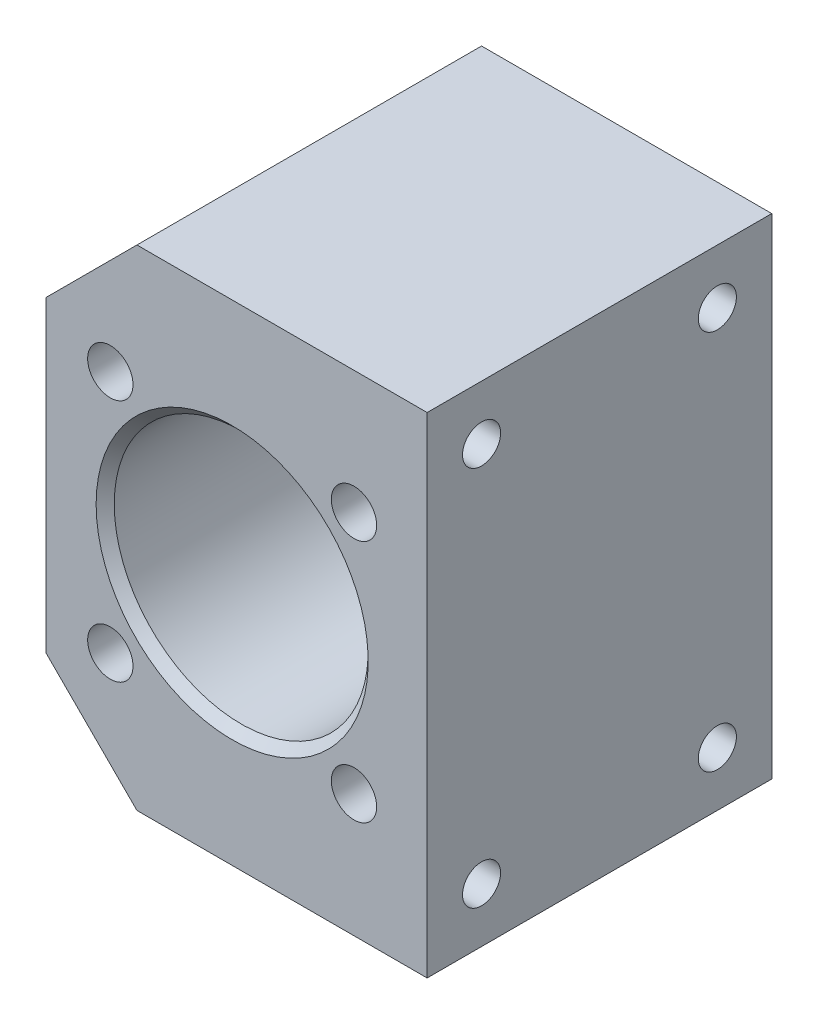
ISO-10303-21;
HEADER;
FILE_DESCRIPTION(('STEP AP214'),'2;1');
FILE_NAME('part.step','',(''),(''),'','','');
FILE_SCHEMA(('AUTOMOTIVE_DESIGN { 1 0 10303 214 1 1 1 1 }'));
ENDSEC;
DATA;
#1=APPLICATION_CONTEXT('core data for automotive mechanical design processes');
#2=APPLICATION_PROTOCOL_DEFINITION('international standard','automotive_design',2000,#1);
#3=PRODUCT_CONTEXT('',#1,'mechanical');
#4=PRODUCT('Part','Part','',(#3));
#5=PRODUCT_RELATED_PRODUCT_CATEGORY('part','',(#4));
#6=PRODUCT_DEFINITION_FORMATION('','',#4);
#7=PRODUCT_DEFINITION_CONTEXT('part definition',#1,'design');
#8=PRODUCT_DEFINITION('design','',#6,#7);
#9=PRODUCT_DEFINITION_SHAPE('','',#8);
#10=(LENGTH_UNIT() NAMED_UNIT(*) SI_UNIT(.MILLI.,.METRE.));
#11=(NAMED_UNIT(*) PLANE_ANGLE_UNIT() SI_UNIT($,.RADIAN.));
#12=(NAMED_UNIT(*) SI_UNIT($,.STERADIAN.) SOLID_ANGLE_UNIT());
#13=UNCERTAINTY_MEASURE_WITH_UNIT(LENGTH_MEASURE(1.E-05),#10,'distance_accuracy_value','');
#14=(GEOMETRIC_REPRESENTATION_CONTEXT(3) GLOBAL_UNCERTAINTY_ASSIGNED_CONTEXT((#13)) GLOBAL_UNIT_ASSIGNED_CONTEXT((#10,
#11,#12)) REPRESENTATION_CONTEXT('',''));
#15=CARTESIAN_POINT('',(0.,0.,0.));
#16=DIRECTION('',(0.,0.,1.));
#17=DIRECTION('',(1.,0.,0.));
#18=AXIS2_PLACEMENT_3D('',#15,#16,#17);
#19=CARTESIAN_POINT('',(0.,0.,38.));
#20=DIRECTION('',(0.,0.,-1.));
#21=DIRECTION('',(-1.,0.,0.));
#22=AXIS2_PLACEMENT_3D('',#19,#20,#21);
#23=PLANE('',#22);
#24=CARTESIAN_POINT('',(33.9350288425444,40.4350288425444,38.));
#25=DIRECTION('',(0.,0.,1.));
#26=DIRECTION('',(1.,0.,0.));
#27=AXIS2_PLACEMENT_3D('',#24,#25,#26);
#28=CIRCLE('',#27,2.5);
#29=CARTESIAN_POINT('',(36.4350288425444,40.4350288425444,38.));
#30=VERTEX_POINT('',#29);
#31=EDGE_CURVE('E142',#30,#30,#28,.T.);
#32=ORIENTED_EDGE('',*,*,#31,.F.);
#33=EDGE_LOOP('',(#32));
#34=FACE_BOUND('',#33,.T.);
#35=CARTESIAN_POINT('',(7.06497115745558,40.4350288425444,38.));
#36=DIRECTION('',(0.,0.,1.));
#37=DIRECTION('',(1.,0.,0.));
#38=AXIS2_PLACEMENT_3D('',#35,#36,#37);
#39=CIRCLE('',#38,2.5);
#40=CARTESIAN_POINT('',(9.56497115745558,40.4350288425444,38.));
#41=VERTEX_POINT('',#40);
#42=EDGE_CURVE('E148',#41,#41,#39,.T.);
#43=ORIENTED_EDGE('',*,*,#42,.F.);
#44=EDGE_LOOP('',(#43));
#45=FACE_BOUND('',#44,.T.);
#46=CARTESIAN_POINT('',(7.06497115745558,13.5649711574556,38.));
#47=DIRECTION('',(0.,0.,1.));
#48=DIRECTION('',(1.,0.,0.));
#49=AXIS2_PLACEMENT_3D('',#46,#47,#48);
#50=CIRCLE('',#49,2.5);
#51=CARTESIAN_POINT('',(9.56497115745558,13.5649711574556,38.));
#52=VERTEX_POINT('',#51);
#53=EDGE_CURVE('E154',#52,#52,#50,.T.);
#54=ORIENTED_EDGE('',*,*,#53,.F.);
#55=EDGE_LOOP('',(#54));
#56=FACE_BOUND('',#55,.T.);
#57=CARTESIAN_POINT('',(33.9350288425444,13.5649711574556,38.));
#58=DIRECTION('',(0.,0.,1.));
#59=DIRECTION('',(1.,0.,0.));
#60=AXIS2_PLACEMENT_3D('',#57,#58,#59);
#61=CIRCLE('',#60,2.5);
#62=CARTESIAN_POINT('',(36.4350288425444,13.5649711574556,38.));
#63=VERTEX_POINT('',#62);
#64=EDGE_CURVE('E160',#63,#63,#61,.T.);
#65=ORIENTED_EDGE('',*,*,#64,.F.);
#66=EDGE_LOOP('',(#65));
#67=FACE_BOUND('',#66,.T.);
#68=CARTESIAN_POINT('',(20.5,27.,38.));
#69=DIRECTION('',(0.,0.,-1.));
#70=DIRECTION('',(-1.,0.,0.));
#71=AXIS2_PLACEMENT_3D('',#68,#69,#70);
#72=CIRCLE('',#71,15.);
#73=CARTESIAN_POINT('',(5.49999999999998,27.,38.));
#74=VERTEX_POINT('',#73);
#75=EDGE_CURVE('E197',#74,#74,#72,.T.);
#76=ORIENTED_EDGE('',*,*,#75,.T.);
#77=EDGE_LOOP('',(#76));
#78=FACE_BOUND('',#77,.T.);
#79=DIRECTION('',(0.,-1.,0.));
#80=VECTOR('',#79,1.);
#81=CARTESIAN_POINT('',(0.,0.,38.));
#82=LINE('',#81,#80);
#83=CARTESIAN_POINT('',(0.,44.,38.));
#84=VERTEX_POINT('',#83);
#85=CARTESIAN_POINT('',(0.,10.,38.));
#86=VERTEX_POINT('',#85);
#87=EDGE_CURVE('E167',#84,#86,#82,.T.);
#88=ORIENTED_EDGE('',*,*,#87,.T.);
#89=DIRECTION('',(-0.707106781186547,0.707106781186549,0.));
#90=VECTOR('',#89,1.);
#91=CARTESIAN_POINT('',(9.99999999999999,0.,38.));
#92=LINE('',#91,#90);
#93=CARTESIAN_POINT('',(9.99999999999999,0.,38.));
#94=VERTEX_POINT('',#93);
#95=EDGE_CURVE('E40',#86,#94,#92,.F.);
#96=ORIENTED_EDGE('',*,*,#95,.T.);
#97=DIRECTION('',(1.,0.,0.));
#98=VECTOR('',#97,1.);
#99=CARTESIAN_POINT('',(0.,0.,38.));
#100=LINE('',#99,#98);
#101=CARTESIAN_POINT('',(42.,0.,38.));
#102=VERTEX_POINT('',#101);
#103=EDGE_CURVE('E169',#94,#102,#100,.T.);
#104=ORIENTED_EDGE('',*,*,#103,.T.);
#105=DIRECTION('',(0.,1.,0.));
#106=VECTOR('',#105,1.);
#107=CARTESIAN_POINT('',(42.,0.,38.));
#108=LINE('',#107,#106);
#109=CARTESIAN_POINT('',(42.,54.,38.));
#110=VERTEX_POINT('',#109);
#111=EDGE_CURVE('E172',#102,#110,#108,.T.);
#112=ORIENTED_EDGE('',*,*,#111,.T.);
#113=DIRECTION('',(-1.,0.,0.));
#114=VECTOR('',#113,1.);
#115=CARTESIAN_POINT('',(0.,54.,38.));
#116=LINE('',#115,#114);
#117=CARTESIAN_POINT('',(10.,54.,38.));
#118=VERTEX_POINT('',#117);
#119=EDGE_CURVE('E174',#110,#118,#116,.T.);
#120=ORIENTED_EDGE('',*,*,#119,.T.);
#121=DIRECTION('',(0.707106781186548,0.707106781186547,0.));
#122=VECTOR('',#121,1.);
#123=CARTESIAN_POINT('',(0.,44.,38.));
#124=LINE('',#123,#122);
#125=EDGE_CURVE('E211',#118,#84,#124,.F.);
#126=ORIENTED_EDGE('',*,*,#125,.T.);
#127=EDGE_LOOP('',(#88,#96,#104,#112,#120,#126));
#128=FACE_BOUND('',#127,.T.);
#129=ADVANCED_FACE('F32',(#34,#45,#56,#67,#78,#128),#23,.F.);
#130=CARTESIAN_POINT('',(0.,0.,0.));
#131=DIRECTION('',(0.,0.,-1.));
#132=DIRECTION('',(-1.,0.,0.));
#133=AXIS2_PLACEMENT_3D('',#130,#131,#132);
#134=PLANE('',#133);
#135=CARTESIAN_POINT('',(20.5,27.,0.));
#136=DIRECTION('',(0.,0.,-1.));
#137=DIRECTION('',(-1.,0.,0.));
#138=AXIS2_PLACEMENT_3D('',#135,#136,#137);
#139=CIRCLE('',#138,15.);
#140=CARTESIAN_POINT('',(5.49999999999999,27.,0.));
#141=VERTEX_POINT('',#140);
#142=EDGE_CURVE('E188',#141,#141,#139,.F.);
#143=ORIENTED_EDGE('',*,*,#142,.T.);
#144=EDGE_LOOP('',(#143));
#145=FACE_BOUND('',#144,.T.);
#146=DIRECTION('',(1.,0.,0.));
#147=VECTOR('',#146,1.);
#148=CARTESIAN_POINT('',(0.,0.,0.));
#149=LINE('',#148,#147);
#150=CARTESIAN_POINT('',(9.99999999999999,0.,0.));
#151=VERTEX_POINT('',#150);
#152=CARTESIAN_POINT('',(42.,0.,0.));
#153=VERTEX_POINT('',#152);
#154=EDGE_CURVE('E178',#151,#153,#149,.T.);
#155=ORIENTED_EDGE('',*,*,#154,.F.);
#156=DIRECTION('',(0.707106781186547,-0.707106781186549,0.));
#157=VECTOR('',#156,1.);
#158=CARTESIAN_POINT('',(5.00000000000001,5.,0.));
#159=LINE('',#158,#157);
#160=CARTESIAN_POINT('',(0.,10.,0.));
#161=VERTEX_POINT('',#160);
#162=EDGE_CURVE('E205',#151,#161,#159,.F.);
#163=ORIENTED_EDGE('',*,*,#162,.T.);
#164=DIRECTION('',(0.,-1.,0.));
#165=VECTOR('',#164,1.);
#166=CARTESIAN_POINT('',(0.,0.,0.));
#167=LINE('',#166,#165);
#168=CARTESIAN_POINT('',(0.,44.,0.));
#169=VERTEX_POINT('',#168);
#170=EDGE_CURVE('E166',#169,#161,#167,.T.);
#171=ORIENTED_EDGE('',*,*,#170,.F.);
#172=DIRECTION('',(-0.707106781186548,-0.707106781186547,0.));
#173=VECTOR('',#172,1.);
#174=CARTESIAN_POINT('',(-22.,22.0000000000001,0.));
#175=LINE('',#174,#173);
#176=CARTESIAN_POINT('',(10.,54.,0.));
#177=VERTEX_POINT('',#176);
#178=EDGE_CURVE('E203',#169,#177,#175,.F.);
#179=ORIENTED_EDGE('',*,*,#178,.T.);
#180=DIRECTION('',(-1.,0.,0.));
#181=VECTOR('',#180,1.);
#182=CARTESIAN_POINT('',(0.,54.,0.));
#183=LINE('',#182,#181);
#184=CARTESIAN_POINT('',(42.,54.,0.));
#185=VERTEX_POINT('',#184);
#186=EDGE_CURVE('E170',#185,#177,#183,.T.);
#187=ORIENTED_EDGE('',*,*,#186,.F.);
#188=DIRECTION('',(0.,1.,0.));
#189=VECTOR('',#188,1.);
#190=CARTESIAN_POINT('',(42.,0.,0.));
#191=LINE('',#190,#189);
#192=EDGE_CURVE('E180',#153,#185,#191,.T.);
#193=ORIENTED_EDGE('',*,*,#192,.F.);
#194=EDGE_LOOP('',(#155,#163,#171,#179,#187,#193));
#195=FACE_BOUND('',#194,.T.);
#196=ADVANCED_FACE('F225',(#145,#195),#134,.T.);
#197=CARTESIAN_POINT('',(0.,0.,38.));
#198=DIRECTION('',(1.,0.,0.));
#199=DIRECTION('',(0.,0.,-1.));
#200=AXIS2_PLACEMENT_3D('',#197,#198,#199);
#201=PLANE('',#200);
#202=ORIENTED_EDGE('',*,*,#170,.T.);
#203=DIRECTION('',(0.,0.,1.));
#204=VECTOR('',#203,1.);
#205=CARTESIAN_POINT('',(0.,10.,38.));
#206=LINE('',#205,#204);
#207=EDGE_CURVE('E53',#161,#86,#206,.T.);
#208=ORIENTED_EDGE('',*,*,#207,.T.);
#209=ORIENTED_EDGE('',*,*,#87,.F.);
#210=DIRECTION('',(0.,0.,-1.));
#211=VECTOR('',#210,1.);
#212=CARTESIAN_POINT('',(0.,44.,38.));
#213=LINE('',#212,#211);
#214=EDGE_CURVE('E207',#84,#169,#213,.T.);
#215=ORIENTED_EDGE('',*,*,#214,.T.);
#216=EDGE_LOOP('',(#202,#208,#209,#215));
#217=FACE_BOUND('',#216,.T.);
#218=ADVANCED_FACE('F227',(#217),#201,.F.);
#219=CARTESIAN_POINT('',(0.,0.,38.));
#220=DIRECTION('',(0.,1.,0.));
#221=DIRECTION('',(0.,0.,1.));
#222=AXIS2_PLACEMENT_3D('',#219,#220,#221);
#223=PLANE('',#222);
#224=ORIENTED_EDGE('',*,*,#103,.F.);
#225=DIRECTION('',(0.,0.,-1.));
#226=VECTOR('',#225,1.);
#227=CARTESIAN_POINT('',(9.99999999999999,0.,38.));
#228=LINE('',#227,#226);
#229=EDGE_CURVE('E200',#94,#151,#228,.T.);
#230=ORIENTED_EDGE('',*,*,#229,.T.);
#231=ORIENTED_EDGE('',*,*,#154,.T.);
#232=DIRECTION('',(0.,0.,-1.));
#233=VECTOR('',#232,1.);
#234=CARTESIAN_POINT('',(42.,0.,38.));
#235=LINE('',#234,#233);
#236=EDGE_CURVE('E185',#102,#153,#235,.T.);
#237=ORIENTED_EDGE('',*,*,#236,.F.);
#238=EDGE_LOOP('',(#224,#230,#231,#237));
#239=FACE_BOUND('',#238,.T.);
#240=ADVANCED_FACE('F219',(#239),#223,.F.);
#241=CARTESIAN_POINT('',(42.,0.,38.));
#242=DIRECTION('',(-1.,0.,0.));
#243=DIRECTION('',(0.,0.,1.));
#244=AXIS2_PLACEMENT_3D('',#241,#242,#243);
#245=PLANE('',#244);
#246=CARTESIAN_POINT('',(42.,48.,32.));
#247=DIRECTION('',(1.,0.,0.));
#248=DIRECTION('',(0.,0.,-1.));
#249=AXIS2_PLACEMENT_3D('',#246,#247,#248);
#250=CIRCLE('',#249,2.1);
#251=CARTESIAN_POINT('',(42.,48.,29.9));
#252=VERTEX_POINT('',#251);
#253=EDGE_CURVE('E120',#252,#252,#250,.T.);
#254=ORIENTED_EDGE('',*,*,#253,.F.);
#255=EDGE_LOOP('',(#254));
#256=FACE_BOUND('',#255,.T.);
#257=CARTESIAN_POINT('',(42.,48.,6.));
#258=DIRECTION('',(1.,0.,0.));
#259=DIRECTION('',(0.,0.,-1.));
#260=AXIS2_PLACEMENT_3D('',#257,#258,#259);
#261=CIRCLE('',#260,2.1);
#262=CARTESIAN_POINT('',(42.,48.,3.9));
#263=VERTEX_POINT('',#262);
#264=EDGE_CURVE('E119',#263,#263,#261,.T.);
#265=ORIENTED_EDGE('',*,*,#264,.F.);
#266=EDGE_LOOP('',(#265));
#267=FACE_BOUND('',#266,.T.);
#268=CARTESIAN_POINT('',(42.,6.,6.));
#269=DIRECTION('',(1.,0.,0.));
#270=DIRECTION('',(0.,0.,-1.));
#271=AXIS2_PLACEMENT_3D('',#268,#269,#270);
#272=CIRCLE('',#271,2.1);
#273=CARTESIAN_POINT('',(42.,6.,3.9));
#274=VERTEX_POINT('',#273);
#275=EDGE_CURVE('E130',#274,#274,#272,.T.);
#276=ORIENTED_EDGE('',*,*,#275,.F.);
#277=EDGE_LOOP('',(#276));
#278=FACE_BOUND('',#277,.T.);
#279=CARTESIAN_POINT('',(42.,6.,32.));
#280=DIRECTION('',(1.,0.,0.));
#281=DIRECTION('',(0.,0.,-1.));
#282=AXIS2_PLACEMENT_3D('',#279,#280,#281);
#283=CIRCLE('',#282,2.1);
#284=CARTESIAN_POINT('',(42.,6.,29.9));
#285=VERTEX_POINT('',#284);
#286=EDGE_CURVE('E136',#285,#285,#283,.T.);
#287=ORIENTED_EDGE('',*,*,#286,.F.);
#288=EDGE_LOOP('',(#287));
#289=FACE_BOUND('',#288,.T.);
#290=ORIENTED_EDGE('',*,*,#192,.T.);
#291=DIRECTION('',(0.,0.,-1.));
#292=VECTOR('',#291,1.);
#293=CARTESIAN_POINT('',(42.,54.,38.));
#294=LINE('',#293,#292);
#295=EDGE_CURVE('E176',#110,#185,#294,.T.);
#296=ORIENTED_EDGE('',*,*,#295,.F.);
#297=ORIENTED_EDGE('',*,*,#111,.F.);
#298=ORIENTED_EDGE('',*,*,#236,.T.);
#299=EDGE_LOOP('',(#290,#296,#297,#298));
#300=FACE_BOUND('',#299,.T.);
#301=ADVANCED_FACE('F235',(#256,#267,#278,#289,#300),#245,.F.);
#302=CARTESIAN_POINT('',(0.,54.,38.));
#303=DIRECTION('',(0.,-1.,0.));
#304=DIRECTION('',(0.,0.,-1.));
#305=AXIS2_PLACEMENT_3D('',#302,#303,#304);
#306=PLANE('',#305);
#307=ORIENTED_EDGE('',*,*,#186,.T.);
#308=DIRECTION('',(0.,0.,1.));
#309=VECTOR('',#308,1.);
#310=CARTESIAN_POINT('',(10.,54.,38.));
#311=LINE('',#310,#309);
#312=EDGE_CURVE('E11',#177,#118,#311,.T.);
#313=ORIENTED_EDGE('',*,*,#312,.T.);
#314=ORIENTED_EDGE('',*,*,#119,.F.);
#315=ORIENTED_EDGE('',*,*,#295,.T.);
#316=EDGE_LOOP('',(#307,#313,#314,#315));
#317=FACE_BOUND('',#316,.T.);
#318=ADVANCED_FACE('F232',(#317),#306,.F.);
#319=CARTESIAN_POINT('',(20.5,27.,38.));
#320=DIRECTION('',(0.,0.,-1.));
#321=DIRECTION('',(-1.,0.,0.));
#322=AXIS2_PLACEMENT_3D('',#319,#320,#321);
#323=CYLINDRICAL_SURFACE('',#322,14.);
#324=CARTESIAN_POINT('',(20.5,27.,0.999999999999994));
#325=DIRECTION('',(0.,0.,-1.));
#326=DIRECTION('',(-1.,0.,0.));
#327=AXIS2_PLACEMENT_3D('',#324,#325,#326);
#328=CIRCLE('',#327,14.);
#329=CARTESIAN_POINT('',(6.49999999999998,27.,0.999999999999994));
#330=VERTEX_POINT('',#329);
#331=EDGE_CURVE('E194',#330,#330,#328,.T.);
#332=ORIENTED_EDGE('',*,*,#331,.T.);
#333=EDGE_LOOP('',(#332));
#334=FACE_BOUND('',#333,.T.);
#335=CARTESIAN_POINT('',(20.5,27.,37.));
#336=DIRECTION('',(0.,0.,-1.));
#337=DIRECTION('',(-1.,0.,0.));
#338=AXIS2_PLACEMENT_3D('',#335,#336,#337);
#339=CIRCLE('',#338,14.);
#340=CARTESIAN_POINT('',(6.49999999999998,27.,37.));
#341=VERTEX_POINT('',#340);
#342=EDGE_CURVE('E191',#341,#341,#339,.F.);
#343=ORIENTED_EDGE('',*,*,#342,.T.);
#344=EDGE_LOOP('',(#343));
#345=FACE_BOUND('',#344,.T.);
#346=ADVANCED_FACE('F243',(#334,#345),#323,.F.);
#347=CARTESIAN_POINT('',(20.5,27.,0.));
#348=DIRECTION('',(0.,0.,-1.));
#349=DIRECTION('',(-1.,0.,0.));
#350=AXIS2_PLACEMENT_3D('',#347,#348,#349);
#351=CONICAL_SURFACE('',#350,15.,0.785398163397449);
#352=ORIENTED_EDGE('',*,*,#331,.F.);
#353=EDGE_LOOP('',(#352));
#354=FACE_BOUND('',#353,.T.);
#355=ORIENTED_EDGE('',*,*,#142,.F.);
#356=EDGE_LOOP('',(#355));
#357=FACE_BOUND('',#356,.T.);
#358=ADVANCED_FACE('F261',(#354,#357),#351,.F.);
#359=CARTESIAN_POINT('',(20.5,27.,37.));
#360=DIRECTION('',(0.,0.,1.));
#361=DIRECTION('',(1.,0.,0.));
#362=AXIS2_PLACEMENT_3D('',#359,#360,#361);
#363=CONICAL_SURFACE('',#362,14.,0.78539816339745);
#364=ORIENTED_EDGE('',*,*,#75,.F.);
#365=EDGE_LOOP('',(#364));
#366=FACE_BOUND('',#365,.T.);
#367=ORIENTED_EDGE('',*,*,#342,.F.);
#368=EDGE_LOOP('',(#367));
#369=FACE_BOUND('',#368,.T.);
#370=ADVANCED_FACE('F267',(#366,#369),#363,.F.);
#371=CARTESIAN_POINT('',(33.9350288425444,13.5649711574556,21.));
#372=DIRECTION('',(0.,0.,1.));
#373=DIRECTION('',(1.,0.,0.));
#374=AXIS2_PLACEMENT_3D('',#371,#372,#373);
#375=CONICAL_SURFACE('',#374,2.5,1.02974425867665);
#376=CARTESIAN_POINT('',(33.9350288425444,13.5649711574556,19.4978484524311));
#377=VERTEX_POINT('',#376);
#378=VERTEX_LOOP('',#377);
#379=FACE_BOUND('',#378,.T.);
#380=CARTESIAN_POINT('',(33.9350288425444,13.5649711574556,21.));
#381=DIRECTION('',(0.,0.,1.));
#382=DIRECTION('',(1.,0.,0.));
#383=AXIS2_PLACEMENT_3D('',#380,#381,#382);
#384=CIRCLE('',#383,2.5);
#385=CARTESIAN_POINT('',(36.4350288425444,13.5649711574556,21.));
#386=VERTEX_POINT('',#385);
#387=EDGE_CURVE('E163',#386,#386,#384,.T.);
#388=ORIENTED_EDGE('',*,*,#387,.T.);
#389=EDGE_LOOP('',(#388));
#390=FACE_BOUND('',#389,.T.);
#391=ADVANCED_FACE('F263',(#379,#390),#375,.F.);
#392=CARTESIAN_POINT('',(33.9350288425444,13.5649711574556,38.));
#393=DIRECTION('',(0.,0.,1.));
#394=DIRECTION('',(1.,0.,0.));
#395=AXIS2_PLACEMENT_3D('',#392,#393,#394);
#396=CYLINDRICAL_SURFACE('',#395,2.5);
#397=ORIENTED_EDGE('',*,*,#387,.F.);
#398=EDGE_LOOP('',(#397));
#399=FACE_BOUND('',#398,.T.);
#400=ORIENTED_EDGE('',*,*,#64,.T.);
#401=EDGE_LOOP('',(#400));
#402=FACE_BOUND('',#401,.T.);
#403=ADVANCED_FACE('F266',(#399,#402),#396,.F.);
#404=CARTESIAN_POINT('',(7.06497115745558,13.5649711574556,21.));
#405=DIRECTION('',(0.,0.,1.));
#406=DIRECTION('',(1.,0.,0.));
#407=AXIS2_PLACEMENT_3D('',#404,#405,#406);
#408=CONICAL_SURFACE('',#407,2.5,1.02974425867665);
#409=CARTESIAN_POINT('',(7.06497115745558,13.5649711574556,19.4978484524311));
#410=VERTEX_POINT('',#409);
#411=VERTEX_LOOP('',#410);
#412=FACE_BOUND('',#411,.T.);
#413=CARTESIAN_POINT('',(7.06497115745558,13.5649711574556,21.));
#414=DIRECTION('',(0.,0.,1.));
#415=DIRECTION('',(1.,0.,0.));
#416=AXIS2_PLACEMENT_3D('',#413,#414,#415);
#417=CIRCLE('',#416,2.5);
#418=CARTESIAN_POINT('',(9.56497115745558,13.5649711574556,21.));
#419=VERTEX_POINT('',#418);
#420=EDGE_CURVE('E157',#419,#419,#417,.T.);
#421=ORIENTED_EDGE('',*,*,#420,.T.);
#422=EDGE_LOOP('',(#421));
#423=FACE_BOUND('',#422,.T.);
#424=ADVANCED_FACE('F271',(#412,#423),#408,.F.);
#425=CARTESIAN_POINT('',(7.06497115745558,13.5649711574556,38.));
#426=DIRECTION('',(0.,0.,1.));
#427=DIRECTION('',(1.,0.,0.));
#428=AXIS2_PLACEMENT_3D('',#425,#426,#427);
#429=CYLINDRICAL_SURFACE('',#428,2.5);
#430=ORIENTED_EDGE('',*,*,#420,.F.);
#431=EDGE_LOOP('',(#430));
#432=FACE_BOUND('',#431,.T.);
#433=ORIENTED_EDGE('',*,*,#53,.T.);
#434=EDGE_LOOP('',(#433));
#435=FACE_BOUND('',#434,.T.);
#436=ADVANCED_FACE('F275',(#432,#435),#429,.F.);
#437=CARTESIAN_POINT('',(7.06497115745558,40.4350288425444,21.));
#438=DIRECTION('',(0.,0.,1.));
#439=DIRECTION('',(1.,0.,0.));
#440=AXIS2_PLACEMENT_3D('',#437,#438,#439);
#441=CONICAL_SURFACE('',#440,2.5,1.02974425867665);
#442=CARTESIAN_POINT('',(7.06497115745558,40.4350288425444,19.4978484524311));
#443=VERTEX_POINT('',#442);
#444=VERTEX_LOOP('',#443);
#445=FACE_BOUND('',#444,.T.);
#446=CARTESIAN_POINT('',(7.06497115745558,40.4350288425444,21.));
#447=DIRECTION('',(0.,0.,1.));
#448=DIRECTION('',(1.,0.,0.));
#449=AXIS2_PLACEMENT_3D('',#446,#447,#448);
#450=CIRCLE('',#449,2.5);
#451=CARTESIAN_POINT('',(9.56497115745558,40.4350288425444,21.));
#452=VERTEX_POINT('',#451);
#453=EDGE_CURVE('E151',#452,#452,#450,.T.);
#454=ORIENTED_EDGE('',*,*,#453,.T.);
#455=EDGE_LOOP('',(#454));
#456=FACE_BOUND('',#455,.T.);
#457=ADVANCED_FACE('F279',(#445,#456),#441,.F.);
#458=CARTESIAN_POINT('',(7.06497115745558,40.4350288425444,38.));
#459=DIRECTION('',(0.,0.,1.));
#460=DIRECTION('',(1.,0.,0.));
#461=AXIS2_PLACEMENT_3D('',#458,#459,#460);
#462=CYLINDRICAL_SURFACE('',#461,2.5);
#463=ORIENTED_EDGE('',*,*,#453,.F.);
#464=EDGE_LOOP('',(#463));
#465=FACE_BOUND('',#464,.T.);
#466=ORIENTED_EDGE('',*,*,#42,.T.);
#467=EDGE_LOOP('',(#466));
#468=FACE_BOUND('',#467,.T.);
#469=ADVANCED_FACE('F283',(#465,#468),#462,.F.);
#470=CARTESIAN_POINT('',(33.9350288425444,40.4350288425444,21.));
#471=DIRECTION('',(0.,0.,1.));
#472=DIRECTION('',(1.,0.,0.));
#473=AXIS2_PLACEMENT_3D('',#470,#471,#472);
#474=CONICAL_SURFACE('',#473,2.5,1.02974425867665);
#475=CARTESIAN_POINT('',(33.9350288425444,40.4350288425444,19.4978484524311));
#476=VERTEX_POINT('',#475);
#477=VERTEX_LOOP('',#476);
#478=FACE_BOUND('',#477,.T.);
#479=CARTESIAN_POINT('',(33.9350288425444,40.4350288425444,21.));
#480=DIRECTION('',(0.,0.,1.));
#481=DIRECTION('',(1.,0.,0.));
#482=AXIS2_PLACEMENT_3D('',#479,#480,#481);
#483=CIRCLE('',#482,2.5);
#484=CARTESIAN_POINT('',(36.4350288425444,40.4350288425444,21.));
#485=VERTEX_POINT('',#484);
#486=EDGE_CURVE('E145',#485,#485,#483,.T.);
#487=ORIENTED_EDGE('',*,*,#486,.T.);
#488=EDGE_LOOP('',(#487));
#489=FACE_BOUND('',#488,.T.);
#490=ADVANCED_FACE('F287',(#478,#489),#474,.F.);
#491=CARTESIAN_POINT('',(33.9350288425444,40.4350288425444,38.));
#492=DIRECTION('',(0.,0.,1.));
#493=DIRECTION('',(1.,0.,0.));
#494=AXIS2_PLACEMENT_3D('',#491,#492,#493);
#495=CYLINDRICAL_SURFACE('',#494,2.5);
#496=ORIENTED_EDGE('',*,*,#486,.F.);
#497=EDGE_LOOP('',(#496));
#498=FACE_BOUND('',#497,.T.);
#499=ORIENTED_EDGE('',*,*,#31,.T.);
#500=EDGE_LOOP('',(#499));
#501=FACE_BOUND('',#500,.T.);
#502=ADVANCED_FACE('F291',(#498,#501),#495,.F.);
#503=CARTESIAN_POINT('',(17.,6.,32.));
#504=DIRECTION('',(1.,0.,0.));
#505=DIRECTION('',(0.,0.,-1.));
#506=AXIS2_PLACEMENT_3D('',#503,#504,#505);
#507=CONICAL_SURFACE('',#506,2.1,1.02974425867665);
#508=CARTESIAN_POINT('',(15.7381927000421,5.99999999999999,32.));
#509=VERTEX_POINT('',#508);
#510=VERTEX_LOOP('',#509);
#511=FACE_BOUND('',#510,.T.);
#512=CARTESIAN_POINT('',(17.,6.,32.));
#513=DIRECTION('',(1.,0.,0.));
#514=DIRECTION('',(0.,0.,-1.));
#515=AXIS2_PLACEMENT_3D('',#512,#513,#514);
#516=CIRCLE('',#515,2.1);
#517=CARTESIAN_POINT('',(17.,6.,29.9));
#518=VERTEX_POINT('',#517);
#519=EDGE_CURVE('E139',#518,#518,#516,.T.);
#520=ORIENTED_EDGE('',*,*,#519,.T.);
#521=EDGE_LOOP('',(#520));
#522=FACE_BOUND('',#521,.T.);
#523=ADVANCED_FACE('F295',(#511,#522),#507,.F.);
#524=CARTESIAN_POINT('',(42.,6.,32.));
#525=DIRECTION('',(1.,0.,0.));
#526=DIRECTION('',(0.,0.,-1.));
#527=AXIS2_PLACEMENT_3D('',#524,#525,#526);
#528=CYLINDRICAL_SURFACE('',#527,2.1);
#529=ORIENTED_EDGE('',*,*,#519,.F.);
#530=EDGE_LOOP('',(#529));
#531=FACE_BOUND('',#530,.T.);
#532=ORIENTED_EDGE('',*,*,#286,.T.);
#533=EDGE_LOOP('',(#532));
#534=FACE_BOUND('',#533,.T.);
#535=ADVANCED_FACE('F299',(#531,#534),#528,.F.);
#536=CARTESIAN_POINT('',(17.,6.,6.));
#537=DIRECTION('',(1.,0.,0.));
#538=DIRECTION('',(0.,0.,-1.));
#539=AXIS2_PLACEMENT_3D('',#536,#537,#538);
#540=CONICAL_SURFACE('',#539,2.1,1.02974425867665);
#541=CARTESIAN_POINT('',(15.7381927000421,5.99999999999999,6.));
#542=VERTEX_POINT('',#541);
#543=VERTEX_LOOP('',#542);
#544=FACE_BOUND('',#543,.T.);
#545=CARTESIAN_POINT('',(17.,6.,6.));
#546=DIRECTION('',(1.,0.,0.));
#547=DIRECTION('',(0.,0.,-1.));
#548=AXIS2_PLACEMENT_3D('',#545,#546,#547);
#549=CIRCLE('',#548,2.1);
#550=CARTESIAN_POINT('',(17.,6.,3.9));
#551=VERTEX_POINT('',#550);
#552=EDGE_CURVE('E133',#551,#551,#549,.T.);
#553=ORIENTED_EDGE('',*,*,#552,.T.);
#554=EDGE_LOOP('',(#553));
#555=FACE_BOUND('',#554,.T.);
#556=ADVANCED_FACE('F303',(#544,#555),#540,.F.);
#557=CARTESIAN_POINT('',(42.,6.,6.));
#558=DIRECTION('',(1.,0.,0.));
#559=DIRECTION('',(0.,0.,-1.));
#560=AXIS2_PLACEMENT_3D('',#557,#558,#559);
#561=CYLINDRICAL_SURFACE('',#560,2.1);
#562=ORIENTED_EDGE('',*,*,#552,.F.);
#563=EDGE_LOOP('',(#562));
#564=FACE_BOUND('',#563,.T.);
#565=ORIENTED_EDGE('',*,*,#275,.T.);
#566=EDGE_LOOP('',(#565));
#567=FACE_BOUND('',#566,.T.);
#568=ADVANCED_FACE('F307',(#564,#567),#561,.F.);
#569=CARTESIAN_POINT('',(17.,48.,6.));
#570=DIRECTION('',(1.,0.,0.));
#571=DIRECTION('',(0.,0.,-1.));
#572=AXIS2_PLACEMENT_3D('',#569,#570,#571);
#573=CONICAL_SURFACE('',#572,2.1,1.02974425867665);
#574=CARTESIAN_POINT('',(15.7381927000421,48.,6.));
#575=VERTEX_POINT('',#574);
#576=VERTEX_LOOP('',#575);
#577=FACE_BOUND('',#576,.T.);
#578=CARTESIAN_POINT('',(17.,48.,6.));
#579=DIRECTION('',(1.,0.,0.));
#580=DIRECTION('',(0.,0.,-1.));
#581=AXIS2_PLACEMENT_3D('',#578,#579,#580);
#582=CIRCLE('',#581,2.1);
#583=CARTESIAN_POINT('',(17.,48.,3.9));
#584=VERTEX_POINT('',#583);
#585=EDGE_CURVE('E123',#584,#584,#582,.T.);
#586=ORIENTED_EDGE('',*,*,#585,.T.);
#587=EDGE_LOOP('',(#586));
#588=FACE_BOUND('',#587,.T.);
#589=ADVANCED_FACE('F311',(#577,#588),#573,.F.);
#590=CARTESIAN_POINT('',(42.,48.,6.));
#591=DIRECTION('',(1.,0.,0.));
#592=DIRECTION('',(0.,0.,-1.));
#593=AXIS2_PLACEMENT_3D('',#590,#591,#592);
#594=CYLINDRICAL_SURFACE('',#593,2.1);
#595=ORIENTED_EDGE('',*,*,#585,.F.);
#596=EDGE_LOOP('',(#595));
#597=FACE_BOUND('',#596,.T.);
#598=ORIENTED_EDGE('',*,*,#264,.T.);
#599=EDGE_LOOP('',(#598));
#600=FACE_BOUND('',#599,.T.);
#601=ADVANCED_FACE('F113',(#597,#600),#594,.F.);
#602=CARTESIAN_POINT('',(17.,48.,32.));
#603=DIRECTION('',(1.,0.,0.));
#604=DIRECTION('',(0.,0.,-1.));
#605=AXIS2_PLACEMENT_3D('',#602,#603,#604);
#606=CONICAL_SURFACE('',#605,2.1,1.02974425867665);
#607=CARTESIAN_POINT('',(15.7381927000421,48.,32.));
#608=VERTEX_POINT('',#607);
#609=VERTEX_LOOP('',#608);
#610=FACE_BOUND('',#609,.T.);
#611=CARTESIAN_POINT('',(17.,48.,32.));
#612=DIRECTION('',(1.,0.,0.));
#613=DIRECTION('',(0.,0.,-1.));
#614=AXIS2_PLACEMENT_3D('',#611,#612,#613);
#615=CIRCLE('',#614,2.1);
#616=CARTESIAN_POINT('',(17.,48.,29.9));
#617=VERTEX_POINT('',#616);
#618=EDGE_CURVE('E117',#617,#617,#615,.T.);
#619=ORIENTED_EDGE('',*,*,#618,.T.);
#620=EDGE_LOOP('',(#619));
#621=FACE_BOUND('',#620,.T.);
#622=ADVANCED_FACE('F109',(#610,#621),#606,.F.);
#623=CARTESIAN_POINT('',(42.,48.,32.));
#624=DIRECTION('',(1.,0.,0.));
#625=DIRECTION('',(0.,0.,-1.));
#626=AXIS2_PLACEMENT_3D('',#623,#624,#625);
#627=CYLINDRICAL_SURFACE('',#626,2.1);
#628=ORIENTED_EDGE('',*,*,#618,.F.);
#629=EDGE_LOOP('',(#628));
#630=FACE_BOUND('',#629,.T.);
#631=ORIENTED_EDGE('',*,*,#253,.T.);
#632=EDGE_LOOP('',(#631));
#633=FACE_BOUND('',#632,.T.);
#634=ADVANCED_FACE('F112',(#630,#633),#627,.F.);
#635=CARTESIAN_POINT('',(9.99999999999999,0.,38.));
#636=DIRECTION('',(0.707106781186548,0.707106781186546,0.));
#637=DIRECTION('',(0.,0.,-1.));
#638=AXIS2_PLACEMENT_3D('',#635,#636,#637);
#639=PLANE('',#638);
#640=ORIENTED_EDGE('',*,*,#95,.F.);
#641=ORIENTED_EDGE('',*,*,#207,.F.);
#642=ORIENTED_EDGE('',*,*,#162,.F.);
#643=ORIENTED_EDGE('',*,*,#229,.F.);
#644=EDGE_LOOP('',(#640,#641,#642,#643));
#645=FACE_BOUND('',#644,.T.);
#646=ADVANCED_FACE('F222',(#645),#639,.F.);
#647=CARTESIAN_POINT('',(0.,44.,38.));
#648=DIRECTION('',(0.707106781186547,-0.707106781186548,0.));
#649=DIRECTION('',(0.,0.,-1.));
#650=AXIS2_PLACEMENT_3D('',#647,#648,#649);
#651=PLANE('',#650);
#652=ORIENTED_EDGE('',*,*,#125,.F.);
#653=ORIENTED_EDGE('',*,*,#312,.F.);
#654=ORIENTED_EDGE('',*,*,#178,.F.);
#655=ORIENTED_EDGE('',*,*,#214,.F.);
#656=EDGE_LOOP('',(#652,#653,#654,#655));
#657=FACE_BOUND('',#656,.T.);
#658=ADVANCED_FACE('F34',(#657),#651,.F.);
#659=CLOSED_SHELL('',(#129,#196,#218,#240,#301,#318,#346,#358,#370,#391,#403,#424,#436,#457,
#469,#490,#502,#523,#535,#556,#568,#589,#601,#622,#634,#646,#658));
#660=MANIFOLD_SOLID_BREP('B2',#659);
#661=ADVANCED_BREP_SHAPE_REPRESENTATION('',(#18,#660),#14);
#662=SHAPE_DEFINITION_REPRESENTATION(#9,#661);
ENDSEC;
END-ISO-10303-21;
